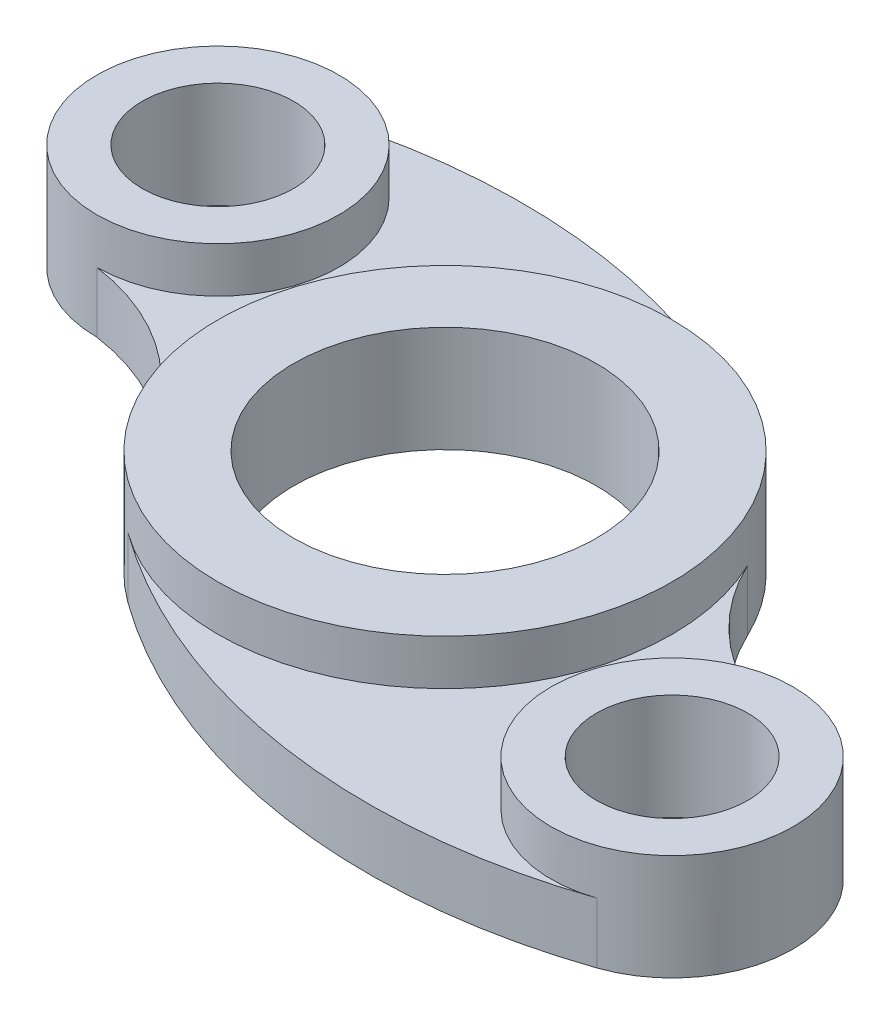
ISO-10303-21;
HEADER;
FILE_DESCRIPTION(('STEP AP214'),'2;1');
FILE_NAME('part.step','',(''),(''),'','','');
FILE_SCHEMA(('AUTOMOTIVE_DESIGN { 1 0 10303 214 1 1 1 1 }'));
ENDSEC;
DATA;
#1=APPLICATION_CONTEXT('core data for automotive mechanical design processes');
#2=APPLICATION_PROTOCOL_DEFINITION('international standard','automotive_design',2000,#1);
#3=PRODUCT_CONTEXT('',#1,'mechanical');
#4=PRODUCT('Part','Part','',(#3));
#5=PRODUCT_RELATED_PRODUCT_CATEGORY('part','',(#4));
#6=PRODUCT_DEFINITION_FORMATION('','',#4);
#7=PRODUCT_DEFINITION_CONTEXT('part definition',#1,'design');
#8=PRODUCT_DEFINITION('design','',#6,#7);
#9=PRODUCT_DEFINITION_SHAPE('','',#8);
#10=(LENGTH_UNIT() NAMED_UNIT(*) SI_UNIT(.MILLI.,.METRE.));
#11=(NAMED_UNIT(*) PLANE_ANGLE_UNIT() SI_UNIT($,.RADIAN.));
#12=(NAMED_UNIT(*) SI_UNIT($,.STERADIAN.) SOLID_ANGLE_UNIT());
#13=UNCERTAINTY_MEASURE_WITH_UNIT(LENGTH_MEASURE(1.E-05),#10,'distance_accuracy_value','');
#14=(GEOMETRIC_REPRESENTATION_CONTEXT(3) GLOBAL_UNCERTAINTY_ASSIGNED_CONTEXT((#13)) GLOBAL_UNIT_ASSIGNED_CONTEXT((#10,
#11,#12)) REPRESENTATION_CONTEXT('',''));
#15=CARTESIAN_POINT('',(0.,0.,0.));
#16=DIRECTION('',(0.,0.,1.));
#17=DIRECTION('',(1.,0.,0.));
#18=AXIS2_PLACEMENT_3D('',#15,#16,#17);
#19=CARTESIAN_POINT('',(-54.2161802278931,8.,25.7022528486632));
#20=DIRECTION('',(0.,-1.,0.));
#21=DIRECTION('',(0.,0.,-1.));
#22=AXIS2_PLACEMENT_3D('',#19,#20,#21);
#23=CYLINDRICAL_SURFACE('',#22,30.);
#24=CARTESIAN_POINT('',(-54.2161802278931,0.,25.7022528486632));
#25=DIRECTION('',(0.,1.,0.));
#26=DIRECTION('',(0.,0.,1.));
#27=AXIS2_PLACEMENT_3D('',#24,#25,#26);
#28=CIRCLE('',#27,30.);
#29=CARTESIAN_POINT('',(-50.,0.,-4.));
#30=VERTEX_POINT('',#29);
#31=CARTESIAN_POINT('',(-27.1080901139465,0.,12.8511264243316));
#32=VERTEX_POINT('',#31);
#33=EDGE_CURVE('E180',#30,#32,#28,.F.);
#34=ORIENTED_EDGE('',*,*,#33,.T.);
#35=DIRECTION('',(0.,-1.,0.));
#36=VECTOR('',#35,1.);
#37=CARTESIAN_POINT('',(-27.1080901139465,8.,12.8511264243316));
#38=LINE('',#37,#36);
#39=CARTESIAN_POINT('',(-27.1080901139465,8.,12.8511264243316));
#40=VERTEX_POINT('',#39);
#41=EDGE_CURVE('E70',#40,#32,#38,.T.);
#42=ORIENTED_EDGE('',*,*,#41,.F.);
#43=CARTESIAN_POINT('',(-54.2161802278931,8.,25.7022528486632));
#44=DIRECTION('',(0.,1.,0.));
#45=DIRECTION('',(0.,0.,1.));
#46=AXIS2_PLACEMENT_3D('',#43,#44,#45);
#47=CIRCLE('',#46,30.);
#48=CARTESIAN_POINT('',(-50.,8.,-4.));
#49=VERTEX_POINT('',#48);
#50=EDGE_CURVE('E186',#49,#40,#47,.F.);
#51=ORIENTED_EDGE('',*,*,#50,.F.);
#52=DIRECTION('',(0.,-1.,0.));
#53=VECTOR('',#52,1.);
#54=CARTESIAN_POINT('',(-50.,8.,-4.));
#55=LINE('',#54,#53);
#56=EDGE_CURVE('E12',#49,#30,#55,.T.);
#57=ORIENTED_EDGE('',*,*,#56,.T.);
#58=EDGE_LOOP('',(#34,#42,#51,#57));
#59=FACE_BOUND('',#58,.T.);
#60=ADVANCED_FACE('F63',(#59),#23,.F.);
#61=CARTESIAN_POINT('',(-29.2582771787085,8.,40.5456929467713));
#62=DIRECTION('',(0.,-1.,0.));
#63=DIRECTION('',(0.,0.,-1.));
#64=AXIS2_PLACEMENT_3D('',#61,#62,#63);
#65=CYLINDRICAL_SURFACE('',#64,80.);
#66=CARTESIAN_POINT('',(-29.2582771787085,0.,40.5456929467713));
#67=DIRECTION('',(0.,1.,0.));
#68=DIRECTION('',(0.,0.,1.));
#69=AXIS2_PLACEMENT_3D('',#66,#67,#68);
#70=CIRCLE('',#69,80.);
#71=CARTESIAN_POINT('',(-55.1854307053229,0.,-35.1364232366928));
#72=VERTEX_POINT('',#71);
#73=CARTESIAN_POINT('',(17.5549663072251,0.,-24.3274157680628));
#74=VERTEX_POINT('',#73);
#75=EDGE_CURVE('E187',#72,#74,#70,.F.);
#76=ORIENTED_EDGE('',*,*,#75,.F.);
#77=DIRECTION('',(0.,-1.,0.));
#78=VECTOR('',#77,1.);
#79=CARTESIAN_POINT('',(-55.1854307053229,8.,-35.1364232366928));
#80=LINE('',#79,#78);
#81=CARTESIAN_POINT('',(-55.1854307053229,8.,-35.1364232366928));
#82=VERTEX_POINT('',#81);
#83=EDGE_CURVE('E195',#82,#72,#80,.T.);
#84=ORIENTED_EDGE('',*,*,#83,.F.);
#85=CARTESIAN_POINT('',(-29.2582771787085,8.,40.5456929467713));
#86=DIRECTION('',(0.,1.,0.));
#87=DIRECTION('',(0.,0.,1.));
#88=AXIS2_PLACEMENT_3D('',#85,#86,#87);
#89=CIRCLE('',#88,80.);
#90=CARTESIAN_POINT('',(17.5549663072251,8.,-24.3274157680628));
#91=VERTEX_POINT('',#90);
#92=EDGE_CURVE('E192',#82,#91,#89,.F.);
#93=ORIENTED_EDGE('',*,*,#92,.T.);
#94=DIRECTION('',(0.,-1.,0.));
#95=VECTOR('',#94,1.);
#96=CARTESIAN_POINT('',(17.5549663072251,8.,-24.3274157680628));
#97=LINE('',#96,#95);
#98=EDGE_CURVE('E202',#91,#74,#97,.T.);
#99=ORIENTED_EDGE('',*,*,#98,.T.);
#100=EDGE_LOOP('',(#76,#84,#93,#99));
#101=FACE_BOUND('',#100,.T.);
#102=ADVANCED_FACE('F230',(#101),#65,.T.);
#103=CARTESIAN_POINT('',(0.,8.,0.));
#104=DIRECTION('',(0.,1.,0.));
#105=DIRECTION('',(0.,0.,1.));
#106=AXIS2_PLACEMENT_3D('',#103,#104,#105);
#107=PLANE('',#106);
#108=CARTESIAN_POINT('',(-50.,8.,-20.));
#109=DIRECTION('',(0.,1.,0.));
#110=DIRECTION('',(0.,0.,1.));
#111=AXIS2_PLACEMENT_3D('',#108,#109,#110);
#112=CIRCLE('',#111,16.);
#113=EDGE_CURVE('E184',#49,#82,#112,.T.);
#114=ORIENTED_EDGE('',*,*,#113,.F.);
#115=ORIENTED_EDGE('',*,*,#50,.T.);
#116=CARTESIAN_POINT('',(0.,8.,0.));
#117=DIRECTION('',(0.,1.,0.));
#118=DIRECTION('',(0.,0.,1.));
#119=AXIS2_PLACEMENT_3D('',#116,#117,#118);
#120=CIRCLE('',#119,30.);
#121=EDGE_CURVE('E190',#91,#40,#120,.T.);
#122=ORIENTED_EDGE('',*,*,#121,.F.);
#123=ORIENTED_EDGE('',*,*,#92,.F.);
#124=EDGE_LOOP('',(#114,#115,#122,#123));
#125=FACE_BOUND('',#124,.T.);
#126=ADVANCED_FACE('F235',(#125),#107,.T.);
#127=CARTESIAN_POINT('',(0.,0.,0.));
#128=DIRECTION('',(0.,1.,0.));
#129=DIRECTION('',(0.,0.,1.));
#130=AXIS2_PLACEMENT_3D('',#127,#128,#129);
#131=PLANE('',#130);
#132=ORIENTED_EDGE('',*,*,#33,.F.);
#133=CARTESIAN_POINT('',(-50.,0.,-20.));
#134=DIRECTION('',(0.,1.,0.));
#135=DIRECTION('',(0.,0.,1.));
#136=AXIS2_PLACEMENT_3D('',#133,#134,#135);
#137=CIRCLE('',#136,16.);
#138=EDGE_CURVE('E177',#72,#30,#137,.T.);
#139=ORIENTED_EDGE('',*,*,#138,.F.);
#140=ORIENTED_EDGE('',*,*,#75,.T.);
#141=CARTESIAN_POINT('',(0.,0.,0.));
#142=DIRECTION('',(0.,1.,0.));
#143=DIRECTION('',(0.,0.,1.));
#144=AXIS2_PLACEMENT_3D('',#141,#142,#143);
#145=CIRCLE('',#144,30.);
#146=CARTESIAN_POINT('',(27.1080901139465,0.,-12.8511264243316));
#147=VERTEX_POINT('',#146);
#148=EDGE_CURVE('E171',#147,#74,#145,.T.);
#149=ORIENTED_EDGE('',*,*,#148,.F.);
#150=CARTESIAN_POINT('',(54.2161802278931,0.,-25.7022528486632));
#151=DIRECTION('',(0.,1.,0.));
#152=DIRECTION('',(0.,0.,1.));
#153=AXIS2_PLACEMENT_3D('',#150,#151,#152);
#154=CIRCLE('',#153,30.);
#155=CARTESIAN_POINT('',(50.,0.,4.00000000000001));
#156=VERTEX_POINT('',#155);
#157=EDGE_CURVE('E151',#147,#156,#154,.T.);
#158=ORIENTED_EDGE('',*,*,#157,.T.);
#159=CARTESIAN_POINT('',(50.,0.,20.));
#160=DIRECTION('',(0.,1.,0.));
#161=DIRECTION('',(0.,0.,1.));
#162=AXIS2_PLACEMENT_3D('',#159,#160,#161);
#163=CIRCLE('',#162,16.);
#164=CARTESIAN_POINT('',(55.1854307053229,0.,35.1364232366928));
#165=VERTEX_POINT('',#164);
#166=EDGE_CURVE('E215',#165,#156,#163,.T.);
#167=ORIENTED_EDGE('',*,*,#166,.F.);
#168=CARTESIAN_POINT('',(29.2582771787085,0.,-40.5456929467713));
#169=DIRECTION('',(0.,1.,0.));
#170=DIRECTION('',(0.,0.,1.));
#171=AXIS2_PLACEMENT_3D('',#168,#169,#170);
#172=CIRCLE('',#171,80.);
#173=CARTESIAN_POINT('',(-17.5549663072251,0.,24.3274157680628));
#174=VERTEX_POINT('',#173);
#175=EDGE_CURVE('E131',#174,#165,#172,.T.);
#176=ORIENTED_EDGE('',*,*,#175,.F.);
#177=EDGE_CURVE('E165',#32,#174,#145,.T.);
#178=ORIENTED_EDGE('',*,*,#177,.F.);
#179=EDGE_LOOP('',(#132,#139,#140,#149,#158,#167,#176,#178));
#180=FACE_BOUND('',#179,.T.);
#181=CARTESIAN_POINT('',(-50.,0.,-20.));
#182=DIRECTION('',(0.,1.,0.));
#183=DIRECTION('',(0.,0.,1.));
#184=AXIS2_PLACEMENT_3D('',#181,#182,#183);
#185=CIRCLE('',#184,9.99999999999999);
#186=CARTESIAN_POINT('',(-50.,0.,-10.));
#187=VERTEX_POINT('',#186);
#188=EDGE_CURVE('E168',#187,#187,#185,.T.);
#189=ORIENTED_EDGE('',*,*,#188,.T.);
#190=EDGE_LOOP('',(#189));
#191=FACE_BOUND('',#190,.T.);
#192=CARTESIAN_POINT('',(0.,0.,0.));
#193=DIRECTION('',(0.,1.,0.));
#194=DIRECTION('',(0.,0.,1.));
#195=AXIS2_PLACEMENT_3D('',#192,#193,#194);
#196=CIRCLE('',#195,20.);
#197=CARTESIAN_POINT('',(0.,0.,20.));
#198=VERTEX_POINT('',#197);
#199=EDGE_CURVE('E160',#198,#198,#196,.T.);
#200=ORIENTED_EDGE('',*,*,#199,.T.);
#201=EDGE_LOOP('',(#200));
#202=FACE_BOUND('',#201,.T.);
#203=CARTESIAN_POINT('',(50.,0.,20.));
#204=DIRECTION('',(0.,1.,0.));
#205=DIRECTION('',(0.,0.,1.));
#206=AXIS2_PLACEMENT_3D('',#203,#204,#205);
#207=CIRCLE('',#206,9.99999999999999);
#208=CARTESIAN_POINT('',(50.,0.,30.));
#209=VERTEX_POINT('',#208);
#210=EDGE_CURVE('E218',#209,#209,#207,.T.);
#211=ORIENTED_EDGE('',*,*,#210,.T.);
#212=EDGE_LOOP('',(#211));
#213=FACE_BOUND('',#212,.T.);
#214=ADVANCED_FACE('F213',(#180,#191,#202,#213),#131,.F.);
#215=CARTESIAN_POINT('',(-50.,14.,-20.));
#216=DIRECTION('',(0.,-1.,0.));
#217=DIRECTION('',(0.,0.,-1.));
#218=AXIS2_PLACEMENT_3D('',#215,#216,#217);
#219=CYLINDRICAL_SURFACE('',#218,16.);
#220=CARTESIAN_POINT('',(-50.,14.,-20.));
#221=DIRECTION('',(0.,1.,0.));
#222=DIRECTION('',(0.,0.,1.));
#223=AXIS2_PLACEMENT_3D('',#220,#221,#222);
#224=CIRCLE('',#223,16.);
#225=CARTESIAN_POINT('',(-50.,14.,-4.));
#226=VERTEX_POINT('',#225);
#227=EDGE_CURVE('E176',#226,#226,#224,.T.);
#228=ORIENTED_EDGE('',*,*,#227,.F.);
#229=EDGE_LOOP('',(#228));
#230=FACE_BOUND('',#229,.T.);
#231=ORIENTED_EDGE('',*,*,#138,.T.);
#232=ORIENTED_EDGE('',*,*,#56,.F.);
#233=ORIENTED_EDGE('',*,*,#113,.T.);
#234=ORIENTED_EDGE('',*,*,#83,.T.);
#235=EDGE_LOOP('',(#231,#232,#233,#234));
#236=FACE_BOUND('',#235,.T.);
#237=ADVANCED_FACE('F237',(#230,#236),#219,.T.);
#238=CARTESIAN_POINT('',(-50.,14.,-20.));
#239=DIRECTION('',(0.,-1.,0.));
#240=DIRECTION('',(0.,0.,-1.));
#241=AXIS2_PLACEMENT_3D('',#238,#239,#240);
#242=CYLINDRICAL_SURFACE('',#241,9.99999999999999);
#243=CARTESIAN_POINT('',(-50.,14.,-20.));
#244=DIRECTION('',(0.,1.,0.));
#245=DIRECTION('',(0.,0.,1.));
#246=AXIS2_PLACEMENT_3D('',#243,#244,#245);
#247=CIRCLE('',#246,9.99999999999999);
#248=CARTESIAN_POINT('',(-50.,14.,-10.));
#249=VERTEX_POINT('',#248);
#250=EDGE_CURVE('E173',#249,#249,#247,.T.);
#251=ORIENTED_EDGE('',*,*,#250,.T.);
#252=EDGE_LOOP('',(#251));
#253=FACE_BOUND('',#252,.T.);
#254=ORIENTED_EDGE('',*,*,#188,.F.);
#255=EDGE_LOOP('',(#254));
#256=FACE_BOUND('',#255,.T.);
#257=ADVANCED_FACE('F239',(#253,#256),#242,.F.);
#258=CARTESIAN_POINT('',(0.,14.,0.));
#259=DIRECTION('',(0.,1.,0.));
#260=DIRECTION('',(0.,0.,1.));
#261=AXIS2_PLACEMENT_3D('',#258,#259,#260);
#262=PLANE('',#261);
#263=ORIENTED_EDGE('',*,*,#250,.F.);
#264=EDGE_LOOP('',(#263));
#265=FACE_BOUND('',#264,.T.);
#266=ORIENTED_EDGE('',*,*,#227,.T.);
#267=EDGE_LOOP('',(#266));
#268=FACE_BOUND('',#267,.T.);
#269=ADVANCED_FACE('F246',(#265,#268),#262,.T.);
#270=CARTESIAN_POINT('',(0.,14.,0.));
#271=DIRECTION('',(0.,-1.,0.));
#272=DIRECTION('',(0.,0.,-1.));
#273=AXIS2_PLACEMENT_3D('',#270,#271,#272);
#274=CYLINDRICAL_SURFACE('',#273,30.);
#275=CARTESIAN_POINT('',(0.,8.,0.));
#276=DIRECTION('',(0.,1.,0.));
#277=DIRECTION('',(0.,0.,1.));
#278=AXIS2_PLACEMENT_3D('',#275,#276,#277);
#279=CIRCLE('',#278,30.);
#280=CARTESIAN_POINT('',(-17.5549663072251,8.,24.3274157680628));
#281=VERTEX_POINT('',#280);
#282=CARTESIAN_POINT('',(27.1080901139465,8.,-12.8511264243316));
#283=VERTEX_POINT('',#282);
#284=EDGE_CURVE('E77',#281,#283,#279,.T.);
#285=ORIENTED_EDGE('',*,*,#284,.T.);
#286=DIRECTION('',(0.,-1.,0.));
#287=VECTOR('',#286,1.);
#288=CARTESIAN_POINT('',(27.1080901139465,8.,-12.8511264243316));
#289=LINE('',#288,#287);
#290=EDGE_CURVE('E158',#283,#147,#289,.T.);
#291=ORIENTED_EDGE('',*,*,#290,.T.);
#292=ORIENTED_EDGE('',*,*,#148,.T.);
#293=ORIENTED_EDGE('',*,*,#98,.F.);
#294=ORIENTED_EDGE('',*,*,#121,.T.);
#295=ORIENTED_EDGE('',*,*,#41,.T.);
#296=ORIENTED_EDGE('',*,*,#177,.T.);
#297=DIRECTION('',(0.,-1.,0.));
#298=VECTOR('',#297,1.);
#299=CARTESIAN_POINT('',(-17.5549663072251,8.,24.3274157680628));
#300=LINE('',#299,#298);
#301=EDGE_CURVE('E82',#281,#174,#300,.T.);
#302=ORIENTED_EDGE('',*,*,#301,.F.);
#303=EDGE_LOOP('',(#285,#291,#292,#293,#294,#295,#296,#302));
#304=FACE_BOUND('',#303,.T.);
#305=CARTESIAN_POINT('',(0.,14.,0.));
#306=DIRECTION('',(0.,1.,0.));
#307=DIRECTION('',(0.,0.,1.));
#308=AXIS2_PLACEMENT_3D('',#305,#306,#307);
#309=CIRCLE('',#308,30.);
#310=CARTESIAN_POINT('',(0.,14.,30.));
#311=VERTEX_POINT('',#310);
#312=EDGE_CURVE('E164',#311,#311,#309,.T.);
#313=ORIENTED_EDGE('',*,*,#312,.F.);
#314=EDGE_LOOP('',(#313));
#315=FACE_BOUND('',#314,.T.);
#316=ADVANCED_FACE('F206',(#304,#315),#274,.T.);
#317=CARTESIAN_POINT('',(0.,14.,0.));
#318=DIRECTION('',(0.,-1.,0.));
#319=DIRECTION('',(0.,0.,-1.));
#320=AXIS2_PLACEMENT_3D('',#317,#318,#319);
#321=CYLINDRICAL_SURFACE('',#320,20.);
#322=CARTESIAN_POINT('',(0.,14.,0.));
#323=DIRECTION('',(0.,1.,0.));
#324=DIRECTION('',(0.,0.,1.));
#325=AXIS2_PLACEMENT_3D('',#322,#323,#324);
#326=CIRCLE('',#325,20.);
#327=CARTESIAN_POINT('',(0.,14.,20.));
#328=VERTEX_POINT('',#327);
#329=EDGE_CURVE('E161',#328,#328,#326,.T.);
#330=ORIENTED_EDGE('',*,*,#329,.T.);
#331=EDGE_LOOP('',(#330));
#332=FACE_BOUND('',#331,.T.);
#333=ORIENTED_EDGE('',*,*,#199,.F.);
#334=EDGE_LOOP('',(#333));
#335=FACE_BOUND('',#334,.T.);
#336=ADVANCED_FACE('F297',(#332,#335),#321,.F.);
#337=CARTESIAN_POINT('',(0.,14.,0.));
#338=DIRECTION('',(0.,1.,0.));
#339=DIRECTION('',(0.,0.,1.));
#340=AXIS2_PLACEMENT_3D('',#337,#338,#339);
#341=PLANE('',#340);
#342=ORIENTED_EDGE('',*,*,#329,.F.);
#343=EDGE_LOOP('',(#342));
#344=FACE_BOUND('',#343,.T.);
#345=ORIENTED_EDGE('',*,*,#312,.T.);
#346=EDGE_LOOP('',(#345));
#347=FACE_BOUND('',#346,.T.);
#348=ADVANCED_FACE('F307',(#344,#347),#341,.T.);
#349=CARTESIAN_POINT('',(54.2161802278931,8.,-25.7022528486632));
#350=DIRECTION('',(0.,-1.,0.));
#351=DIRECTION('',(0.,0.,-1.));
#352=AXIS2_PLACEMENT_3D('',#349,#350,#351);
#353=CYLINDRICAL_SURFACE('',#352,30.);
#354=ORIENTED_EDGE('',*,*,#157,.F.);
#355=ORIENTED_EDGE('',*,*,#290,.F.);
#356=CARTESIAN_POINT('',(54.2161802278931,8.,-25.7022528486632));
#357=DIRECTION('',(0.,1.,0.));
#358=DIRECTION('',(0.,0.,1.));
#359=AXIS2_PLACEMENT_3D('',#356,#357,#358);
#360=CIRCLE('',#359,30.);
#361=CARTESIAN_POINT('',(50.,8.,4.00000000000001));
#362=VERTEX_POINT('',#361);
#363=EDGE_CURVE('E155',#283,#362,#360,.T.);
#364=ORIENTED_EDGE('',*,*,#363,.T.);
#365=DIRECTION('',(0.,-1.,0.));
#366=VECTOR('',#365,1.);
#367=CARTESIAN_POINT('',(50.,8.,4.00000000000001));
#368=LINE('',#367,#366);
#369=EDGE_CURVE('E136',#362,#156,#368,.T.);
#370=ORIENTED_EDGE('',*,*,#369,.T.);
#371=EDGE_LOOP('',(#354,#355,#364,#370));
#372=FACE_BOUND('',#371,.T.);
#373=ADVANCED_FACE('F227',(#372),#353,.F.);
#374=CARTESIAN_POINT('',(29.2582771787085,8.,-40.5456929467713));
#375=DIRECTION('',(0.,-1.,0.));
#376=DIRECTION('',(0.,0.,-1.));
#377=AXIS2_PLACEMENT_3D('',#374,#375,#376);
#378=CYLINDRICAL_SURFACE('',#377,80.);
#379=ORIENTED_EDGE('',*,*,#175,.T.);
#380=DIRECTION('',(0.,-1.,0.));
#381=VECTOR('',#380,1.);
#382=CARTESIAN_POINT('',(55.1854307053229,8.,35.1364232366928));
#383=LINE('',#382,#381);
#384=CARTESIAN_POINT('',(55.1854307053229,8.,35.1364232366928));
#385=VERTEX_POINT('',#384);
#386=EDGE_CURVE('E126',#385,#165,#383,.T.);
#387=ORIENTED_EDGE('',*,*,#386,.F.);
#388=CARTESIAN_POINT('',(29.2582771787085,8.,-40.5456929467713));
#389=DIRECTION('',(0.,1.,0.));
#390=DIRECTION('',(0.,0.,1.));
#391=AXIS2_PLACEMENT_3D('',#388,#389,#390);
#392=CIRCLE('',#391,80.);
#393=EDGE_CURVE('E129',#281,#385,#392,.T.);
#394=ORIENTED_EDGE('',*,*,#393,.F.);
#395=ORIENTED_EDGE('',*,*,#301,.T.);
#396=EDGE_LOOP('',(#379,#387,#394,#395));
#397=FACE_BOUND('',#396,.T.);
#398=ADVANCED_FACE('F128',(#397),#378,.T.);
#399=CARTESIAN_POINT('',(0.,8.,0.));
#400=DIRECTION('',(0.,1.,0.));
#401=DIRECTION('',(0.,0.,1.));
#402=AXIS2_PLACEMENT_3D('',#399,#400,#401);
#403=PLANE('',#402);
#404=ORIENTED_EDGE('',*,*,#363,.F.);
#405=ORIENTED_EDGE('',*,*,#284,.F.);
#406=ORIENTED_EDGE('',*,*,#393,.T.);
#407=CARTESIAN_POINT('',(50.,8.,20.));
#408=DIRECTION('',(0.,1.,0.));
#409=DIRECTION('',(0.,0.,1.));
#410=AXIS2_PLACEMENT_3D('',#407,#408,#409);
#411=CIRCLE('',#410,16.);
#412=EDGE_CURVE('E142',#362,#385,#411,.T.);
#413=ORIENTED_EDGE('',*,*,#412,.F.);
#414=EDGE_LOOP('',(#404,#405,#406,#413));
#415=FACE_BOUND('',#414,.T.);
#416=ADVANCED_FACE('F141',(#415),#403,.T.);
#417=CARTESIAN_POINT('',(50.,14.,20.));
#418=DIRECTION('',(0.,-1.,0.));
#419=DIRECTION('',(0.,0.,-1.));
#420=AXIS2_PLACEMENT_3D('',#417,#418,#419);
#421=CYLINDRICAL_SURFACE('',#420,9.99999999999999);
#422=CARTESIAN_POINT('',(50.,14.,20.));
#423=DIRECTION('',(0.,1.,0.));
#424=DIRECTION('',(0.,0.,1.));
#425=AXIS2_PLACEMENT_3D('',#422,#423,#424);
#426=CIRCLE('',#425,9.99999999999999);
#427=CARTESIAN_POINT('',(50.,14.,30.));
#428=VERTEX_POINT('',#427);
#429=EDGE_CURVE('E217',#428,#428,#426,.T.);
#430=ORIENTED_EDGE('',*,*,#429,.T.);
#431=EDGE_LOOP('',(#430));
#432=FACE_BOUND('',#431,.T.);
#433=ORIENTED_EDGE('',*,*,#210,.F.);
#434=EDGE_LOOP('',(#433));
#435=FACE_BOUND('',#434,.T.);
#436=ADVANCED_FACE('F346',(#432,#435),#421,.F.);
#437=CARTESIAN_POINT('',(50.,14.,20.));
#438=DIRECTION('',(0.,-1.,0.));
#439=DIRECTION('',(0.,0.,-1.));
#440=AXIS2_PLACEMENT_3D('',#437,#438,#439);
#441=CYLINDRICAL_SURFACE('',#440,16.);
#442=ORIENTED_EDGE('',*,*,#369,.F.);
#443=ORIENTED_EDGE('',*,*,#412,.T.);
#444=ORIENTED_EDGE('',*,*,#386,.T.);
#445=ORIENTED_EDGE('',*,*,#166,.T.);
#446=EDGE_LOOP('',(#442,#443,#444,#445));
#447=FACE_BOUND('',#446,.T.);
#448=CARTESIAN_POINT('',(50.,14.,20.));
#449=DIRECTION('',(0.,1.,0.));
#450=DIRECTION('',(0.,0.,1.));
#451=AXIS2_PLACEMENT_3D('',#448,#449,#450);
#452=CIRCLE('',#451,16.);
#453=CARTESIAN_POINT('',(50.,14.,36.));
#454=VERTEX_POINT('',#453);
#455=EDGE_CURVE('E154',#454,#454,#452,.T.);
#456=ORIENTED_EDGE('',*,*,#455,.F.);
#457=EDGE_LOOP('',(#456));
#458=FACE_BOUND('',#457,.T.);
#459=ADVANCED_FACE('F145',(#447,#458),#441,.T.);
#460=CARTESIAN_POINT('',(0.,14.,0.));
#461=DIRECTION('',(0.,1.,0.));
#462=DIRECTION('',(0.,0.,1.));
#463=AXIS2_PLACEMENT_3D('',#460,#461,#462);
#464=PLANE('',#463);
#465=ORIENTED_EDGE('',*,*,#429,.F.);
#466=EDGE_LOOP('',(#465));
#467=FACE_BOUND('',#466,.T.);
#468=ORIENTED_EDGE('',*,*,#455,.T.);
#469=EDGE_LOOP('',(#468));
#470=FACE_BOUND('',#469,.T.);
#471=ADVANCED_FACE('F364',(#467,#470),#464,.T.);
#472=CLOSED_SHELL('',(#60,#102,#126,#214,#237,#257,#269,#316,#336,#348,#373,#398,#416,#436,#459,#471));
#473=MANIFOLD_SOLID_BREP('B2',#472);
#474=ADVANCED_BREP_SHAPE_REPRESENTATION('',(#18,#473),#14);
#475=SHAPE_DEFINITION_REPRESENTATION(#9,#474);
ENDSEC;
END-ISO-10303-21;
